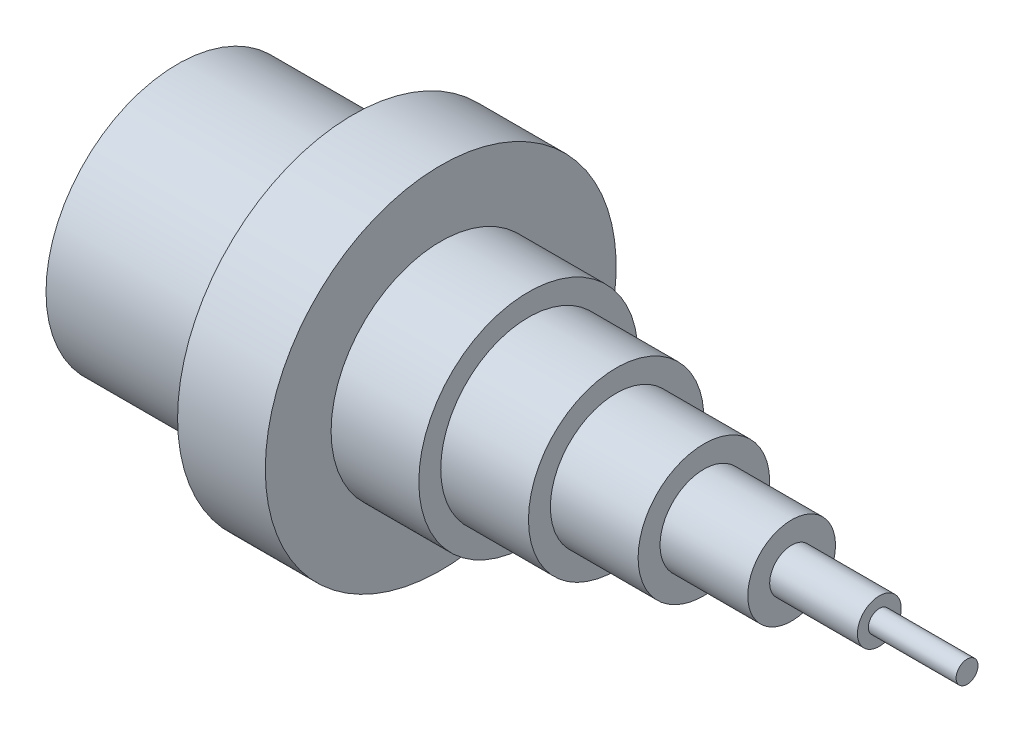
ISO-10303-21;
HEADER;
FILE_DESCRIPTION(('STEP AP214'),'2;1');
FILE_NAME('part.step','',(''),(''),'','','');
FILE_SCHEMA(('AUTOMOTIVE_DESIGN { 1 0 10303 214 1 1 1 1 }'));
ENDSEC;
DATA;
#1=APPLICATION_CONTEXT('core data for automotive mechanical design processes');
#2=APPLICATION_PROTOCOL_DEFINITION('international standard','automotive_design',2000,#1);
#3=PRODUCT_CONTEXT('',#1,'mechanical');
#4=PRODUCT('Part','Part','',(#3));
#5=PRODUCT_RELATED_PRODUCT_CATEGORY('part','',(#4));
#6=PRODUCT_DEFINITION_FORMATION('','',#4);
#7=PRODUCT_DEFINITION_CONTEXT('part definition',#1,'design');
#8=PRODUCT_DEFINITION('design','',#6,#7);
#9=PRODUCT_DEFINITION_SHAPE('','',#8);
#10=(LENGTH_UNIT() NAMED_UNIT(*) SI_UNIT(.MILLI.,.METRE.));
#11=(NAMED_UNIT(*) PLANE_ANGLE_UNIT() SI_UNIT($,.RADIAN.));
#12=(NAMED_UNIT(*) SI_UNIT($,.STERADIAN.) SOLID_ANGLE_UNIT());
#13=UNCERTAINTY_MEASURE_WITH_UNIT(LENGTH_MEASURE(1.E-05),#10,'distance_accuracy_value','');
#14=(GEOMETRIC_REPRESENTATION_CONTEXT(3) GLOBAL_UNCERTAINTY_ASSIGNED_CONTEXT((#13)) GLOBAL_UNIT_ASSIGNED_CONTEXT((#10,
#11,#12)) REPRESENTATION_CONTEXT('',''));
#15=CARTESIAN_POINT('',(0.,0.,0.));
#16=DIRECTION('',(0.,0.,1.));
#17=DIRECTION('',(1.,0.,0.));
#18=AXIS2_PLACEMENT_3D('',#15,#16,#17);
#19=CARTESIAN_POINT('',(0.,0.,0.));
#20=DIRECTION('',(-1.,0.,0.));
#21=DIRECTION('',(0.,0.,1.));
#22=AXIS2_PLACEMENT_3D('',#19,#20,#21);
#23=CYLINDRICAL_SURFACE('',#22,30.);
#24=CARTESIAN_POINT('',(-40.,0.,0.));
#25=DIRECTION('',(-1.,0.,0.));
#26=DIRECTION('',(0.,0.,1.));
#27=AXIS2_PLACEMENT_3D('',#24,#25,#26);
#28=CIRCLE('',#27,30.);
#29=CARTESIAN_POINT('',(-40.,0.,30.));
#30=VERTEX_POINT('',#29);
#31=EDGE_CURVE('E10',#30,#30,#28,.T.);
#32=ORIENTED_EDGE('',*,*,#31,.F.);
#33=EDGE_LOOP('',(#32));
#34=FACE_BOUND('',#33,.T.);
#35=CARTESIAN_POINT('',(0.,0.,0.));
#36=DIRECTION('',(-1.,0.,0.));
#37=DIRECTION('',(0.,0.,1.));
#38=AXIS2_PLACEMENT_3D('',#35,#36,#37);
#39=CIRCLE('',#38,30.);
#40=CARTESIAN_POINT('',(0.,0.,30.));
#41=VERTEX_POINT('',#40);
#42=EDGE_CURVE('E91',#41,#41,#39,.T.);
#43=ORIENTED_EDGE('',*,*,#42,.T.);
#44=EDGE_LOOP('',(#43));
#45=FACE_BOUND('',#44,.T.);
#46=ADVANCED_FACE('F33',(#34,#45),#23,.T.);
#47=CARTESIAN_POINT('',(-40.,0.,0.));
#48=DIRECTION('',(1.,0.,0.));
#49=DIRECTION('',(0.,0.,-1.));
#50=AXIS2_PLACEMENT_3D('',#47,#48,#49);
#51=PLANE('',#50);
#52=CARTESIAN_POINT('',(-40.,0.,0.));
#53=DIRECTION('',(-1.,0.,0.));
#54=DIRECTION('',(0.,0.,1.));
#55=AXIS2_PLACEMENT_3D('',#52,#53,#54);
#56=CIRCLE('',#55,20.);
#57=CARTESIAN_POINT('',(-40.,0.,20.));
#58=VERTEX_POINT('',#57);
#59=EDGE_CURVE('E39',#58,#58,#56,.T.);
#60=ORIENTED_EDGE('',*,*,#59,.F.);
#61=EDGE_LOOP('',(#60));
#62=FACE_BOUND('',#61,.T.);
#63=ORIENTED_EDGE('',*,*,#31,.T.);
#64=EDGE_LOOP('',(#63));
#65=FACE_BOUND('',#64,.T.);
#66=ADVANCED_FACE('F113',(#62,#65),#51,.F.);
#67=CARTESIAN_POINT('',(0.,0.,0.));
#68=DIRECTION('',(-1.,0.,0.));
#69=DIRECTION('',(0.,0.,1.));
#70=AXIS2_PLACEMENT_3D('',#67,#68,#69);
#71=CYLINDRICAL_SURFACE('',#70,20.);
#72=ORIENTED_EDGE('',*,*,#59,.T.);
#73=EDGE_LOOP('',(#72));
#74=FACE_BOUND('',#73,.T.);
#75=CARTESIAN_POINT('',(0.,0.,0.));
#76=DIRECTION('',(-1.,0.,0.));
#77=DIRECTION('',(0.,0.,1.));
#78=AXIS2_PLACEMENT_3D('',#75,#76,#77);
#79=CIRCLE('',#78,20.);
#80=CARTESIAN_POINT('',(0.,0.,20.));
#81=VERTEX_POINT('',#80);
#82=EDGE_CURVE('E43',#81,#81,#79,.T.);
#83=ORIENTED_EDGE('',*,*,#82,.F.);
#84=EDGE_LOOP('',(#83));
#85=FACE_BOUND('',#84,.T.);
#86=ADVANCED_FACE('F110',(#74,#85),#71,.F.);
#87=CARTESIAN_POINT('',(0.,0.,0.));
#88=DIRECTION('',(-1.,0.,0.));
#89=DIRECTION('',(0.,0.,1.));
#90=AXIS2_PLACEMENT_3D('',#87,#88,#89);
#91=PLANE('',#90);
#92=ORIENTED_EDGE('',*,*,#82,.T.);
#93=EDGE_LOOP('',(#92));
#94=FACE_BOUND('',#93,.T.);
#95=ADVANCED_FACE('F101',(#94),#91,.T.);
#96=CARTESIAN_POINT('',(140.,0.,0.));
#97=DIRECTION('',(-1.,0.,0.));
#98=DIRECTION('',(0.,0.,1.));
#99=AXIS2_PLACEMENT_3D('',#96,#97,#98);
#100=PLANE('',#99);
#101=CARTESIAN_POINT('',(140.,0.,0.));
#102=DIRECTION('',(-1.,0.,0.));
#103=DIRECTION('',(0.,0.,1.));
#104=AXIS2_PLACEMENT_3D('',#101,#102,#103);
#105=CIRCLE('',#104,2.5);
#106=CARTESIAN_POINT('',(140.,0.,2.5));
#107=VERTEX_POINT('',#106);
#108=EDGE_CURVE('E47',#107,#107,#105,.T.);
#109=ORIENTED_EDGE('',*,*,#108,.F.);
#110=EDGE_LOOP('',(#109));
#111=FACE_BOUND('',#110,.T.);
#112=ADVANCED_FACE('F109',(#111),#100,.F.);
#113=CARTESIAN_POINT('',(0.,0.,0.));
#114=DIRECTION('',(-1.,0.,0.));
#115=DIRECTION('',(0.,0.,1.));
#116=AXIS2_PLACEMENT_3D('',#113,#114,#115);
#117=CYLINDRICAL_SURFACE('',#116,2.5);
#118=ORIENTED_EDGE('',*,*,#108,.T.);
#119=EDGE_LOOP('',(#118));
#120=FACE_BOUND('',#119,.T.);
#121=CARTESIAN_POINT('',(120.,0.,0.));
#122=DIRECTION('',(-1.,0.,0.));
#123=DIRECTION('',(0.,0.,1.));
#124=AXIS2_PLACEMENT_3D('',#121,#122,#123);
#125=CIRCLE('',#124,2.5);
#126=CARTESIAN_POINT('',(120.,0.,2.5));
#127=VERTEX_POINT('',#126);
#128=EDGE_CURVE('E52',#127,#127,#125,.T.);
#129=ORIENTED_EDGE('',*,*,#128,.F.);
#130=EDGE_LOOP('',(#129));
#131=FACE_BOUND('',#130,.T.);
#132=ADVANCED_FACE('F126',(#120,#131),#117,.T.);
#133=CARTESIAN_POINT('',(120.,0.,0.));
#134=DIRECTION('',(-1.,0.,0.));
#135=DIRECTION('',(0.,0.,1.));
#136=AXIS2_PLACEMENT_3D('',#133,#134,#135);
#137=PLANE('',#136);
#138=CARTESIAN_POINT('',(120.,0.,0.));
#139=DIRECTION('',(-1.,0.,0.));
#140=DIRECTION('',(0.,0.,1.));
#141=AXIS2_PLACEMENT_3D('',#138,#139,#140);
#142=CIRCLE('',#141,5.);
#143=CARTESIAN_POINT('',(120.,0.,5.));
#144=VERTEX_POINT('',#143);
#145=EDGE_CURVE('E55',#144,#144,#142,.T.);
#146=ORIENTED_EDGE('',*,*,#145,.F.);
#147=EDGE_LOOP('',(#146));
#148=FACE_BOUND('',#147,.T.);
#149=ORIENTED_EDGE('',*,*,#128,.T.);
#150=EDGE_LOOP('',(#149));
#151=FACE_BOUND('',#150,.T.);
#152=ADVANCED_FACE('F130',(#148,#151),#137,.F.);
#153=CARTESIAN_POINT('',(0.,0.,0.));
#154=DIRECTION('',(-1.,0.,0.));
#155=DIRECTION('',(0.,0.,1.));
#156=AXIS2_PLACEMENT_3D('',#153,#154,#155);
#157=CYLINDRICAL_SURFACE('',#156,5.);
#158=ORIENTED_EDGE('',*,*,#145,.T.);
#159=EDGE_LOOP('',(#158));
#160=FACE_BOUND('',#159,.T.);
#161=CARTESIAN_POINT('',(100.,0.,0.));
#162=DIRECTION('',(-1.,0.,0.));
#163=DIRECTION('',(0.,0.,1.));
#164=AXIS2_PLACEMENT_3D('',#161,#162,#163);
#165=CIRCLE('',#164,5.);
#166=CARTESIAN_POINT('',(100.,0.,5.));
#167=VERTEX_POINT('',#166);
#168=EDGE_CURVE('E58',#167,#167,#165,.T.);
#169=ORIENTED_EDGE('',*,*,#168,.F.);
#170=EDGE_LOOP('',(#169));
#171=FACE_BOUND('',#170,.T.);
#172=ADVANCED_FACE('F134',(#160,#171),#157,.T.);
#173=CARTESIAN_POINT('',(100.,0.,0.));
#174=DIRECTION('',(-1.,0.,0.));
#175=DIRECTION('',(0.,0.,1.));
#176=AXIS2_PLACEMENT_3D('',#173,#174,#175);
#177=PLANE('',#176);
#178=CARTESIAN_POINT('',(100.,0.,0.));
#179=DIRECTION('',(-1.,0.,0.));
#180=DIRECTION('',(0.,0.,1.));
#181=AXIS2_PLACEMENT_3D('',#178,#179,#180);
#182=CIRCLE('',#181,10.);
#183=CARTESIAN_POINT('',(100.,0.,10.));
#184=VERTEX_POINT('',#183);
#185=EDGE_CURVE('E61',#184,#184,#182,.T.);
#186=ORIENTED_EDGE('',*,*,#185,.F.);
#187=EDGE_LOOP('',(#186));
#188=FACE_BOUND('',#187,.T.);
#189=ORIENTED_EDGE('',*,*,#168,.T.);
#190=EDGE_LOOP('',(#189));
#191=FACE_BOUND('',#190,.T.);
#192=ADVANCED_FACE('F138',(#188,#191),#177,.F.);
#193=CARTESIAN_POINT('',(0.,0.,0.));
#194=DIRECTION('',(-1.,0.,0.));
#195=DIRECTION('',(0.,0.,1.));
#196=AXIS2_PLACEMENT_3D('',#193,#194,#195);
#197=CYLINDRICAL_SURFACE('',#196,10.);
#198=ORIENTED_EDGE('',*,*,#185,.T.);
#199=EDGE_LOOP('',(#198));
#200=FACE_BOUND('',#199,.T.);
#201=CARTESIAN_POINT('',(80.,0.,0.));
#202=DIRECTION('',(-1.,0.,0.));
#203=DIRECTION('',(0.,0.,1.));
#204=AXIS2_PLACEMENT_3D('',#201,#202,#203);
#205=CIRCLE('',#204,10.);
#206=CARTESIAN_POINT('',(80.,0.,10.));
#207=VERTEX_POINT('',#206);
#208=EDGE_CURVE('E64',#207,#207,#205,.T.);
#209=ORIENTED_EDGE('',*,*,#208,.F.);
#210=EDGE_LOOP('',(#209));
#211=FACE_BOUND('',#210,.T.);
#212=ADVANCED_FACE('F142',(#200,#211),#197,.T.);
#213=CARTESIAN_POINT('',(80.,0.,0.));
#214=DIRECTION('',(-1.,0.,0.));
#215=DIRECTION('',(0.,0.,1.));
#216=AXIS2_PLACEMENT_3D('',#213,#214,#215);
#217=PLANE('',#216);
#218=CARTESIAN_POINT('',(80.,0.,0.));
#219=DIRECTION('',(-1.,0.,0.));
#220=DIRECTION('',(0.,0.,1.));
#221=AXIS2_PLACEMENT_3D('',#218,#219,#220);
#222=CIRCLE('',#221,15.);
#223=CARTESIAN_POINT('',(80.,0.,15.));
#224=VERTEX_POINT('',#223);
#225=EDGE_CURVE('E67',#224,#224,#222,.T.);
#226=ORIENTED_EDGE('',*,*,#225,.F.);
#227=EDGE_LOOP('',(#226));
#228=FACE_BOUND('',#227,.T.);
#229=ORIENTED_EDGE('',*,*,#208,.T.);
#230=EDGE_LOOP('',(#229));
#231=FACE_BOUND('',#230,.T.);
#232=ADVANCED_FACE('F146',(#228,#231),#217,.F.);
#233=CARTESIAN_POINT('',(0.,0.,0.));
#234=DIRECTION('',(-1.,0.,0.));
#235=DIRECTION('',(0.,0.,1.));
#236=AXIS2_PLACEMENT_3D('',#233,#234,#235);
#237=CYLINDRICAL_SURFACE('',#236,15.);
#238=ORIENTED_EDGE('',*,*,#225,.T.);
#239=EDGE_LOOP('',(#238));
#240=FACE_BOUND('',#239,.T.);
#241=CARTESIAN_POINT('',(60.,0.,0.));
#242=DIRECTION('',(-1.,0.,0.));
#243=DIRECTION('',(0.,0.,1.));
#244=AXIS2_PLACEMENT_3D('',#241,#242,#243);
#245=CIRCLE('',#244,15.);
#246=CARTESIAN_POINT('',(60.,0.,15.));
#247=VERTEX_POINT('',#246);
#248=EDGE_CURVE('E70',#247,#247,#245,.T.);
#249=ORIENTED_EDGE('',*,*,#248,.F.);
#250=EDGE_LOOP('',(#249));
#251=FACE_BOUND('',#250,.T.);
#252=ADVANCED_FACE('F150',(#240,#251),#237,.T.);
#253=CARTESIAN_POINT('',(60.,0.,0.));
#254=DIRECTION('',(-1.,0.,0.));
#255=DIRECTION('',(0.,0.,1.));
#256=AXIS2_PLACEMENT_3D('',#253,#254,#255);
#257=PLANE('',#256);
#258=CARTESIAN_POINT('',(60.,0.,0.));
#259=DIRECTION('',(-1.,0.,0.));
#260=DIRECTION('',(0.,0.,1.));
#261=AXIS2_PLACEMENT_3D('',#258,#259,#260);
#262=CIRCLE('',#261,20.);
#263=CARTESIAN_POINT('',(60.,0.,20.));
#264=VERTEX_POINT('',#263);
#265=EDGE_CURVE('E73',#264,#264,#262,.T.);
#266=ORIENTED_EDGE('',*,*,#265,.F.);
#267=EDGE_LOOP('',(#266));
#268=FACE_BOUND('',#267,.T.);
#269=ORIENTED_EDGE('',*,*,#248,.T.);
#270=EDGE_LOOP('',(#269));
#271=FACE_BOUND('',#270,.T.);
#272=ADVANCED_FACE('F154',(#268,#271),#257,.F.);
#273=CARTESIAN_POINT('',(0.,0.,0.));
#274=DIRECTION('',(-1.,0.,0.));
#275=DIRECTION('',(0.,0.,1.));
#276=AXIS2_PLACEMENT_3D('',#273,#274,#275);
#277=CYLINDRICAL_SURFACE('',#276,20.);
#278=ORIENTED_EDGE('',*,*,#265,.T.);
#279=EDGE_LOOP('',(#278));
#280=FACE_BOUND('',#279,.T.);
#281=CARTESIAN_POINT('',(40.,0.,0.));
#282=DIRECTION('',(-1.,0.,0.));
#283=DIRECTION('',(0.,0.,1.));
#284=AXIS2_PLACEMENT_3D('',#281,#282,#283);
#285=CIRCLE('',#284,20.);
#286=CARTESIAN_POINT('',(40.,0.,20.));
#287=VERTEX_POINT('',#286);
#288=EDGE_CURVE('E76',#287,#287,#285,.T.);
#289=ORIENTED_EDGE('',*,*,#288,.F.);
#290=EDGE_LOOP('',(#289));
#291=FACE_BOUND('',#290,.T.);
#292=ADVANCED_FACE('F158',(#280,#291),#277,.T.);
#293=CARTESIAN_POINT('',(40.,0.,0.));
#294=DIRECTION('',(-1.,0.,0.));
#295=DIRECTION('',(0.,0.,1.));
#296=AXIS2_PLACEMENT_3D('',#293,#294,#295);
#297=PLANE('',#296);
#298=CARTESIAN_POINT('',(40.,0.,0.));
#299=DIRECTION('',(-1.,0.,0.));
#300=DIRECTION('',(0.,0.,1.));
#301=AXIS2_PLACEMENT_3D('',#298,#299,#300);
#302=CIRCLE('',#301,25.);
#303=CARTESIAN_POINT('',(40.,0.,25.));
#304=VERTEX_POINT('',#303);
#305=EDGE_CURVE('E79',#304,#304,#302,.T.);
#306=ORIENTED_EDGE('',*,*,#305,.F.);
#307=EDGE_LOOP('',(#306));
#308=FACE_BOUND('',#307,.T.);
#309=ORIENTED_EDGE('',*,*,#288,.T.);
#310=EDGE_LOOP('',(#309));
#311=FACE_BOUND('',#310,.T.);
#312=ADVANCED_FACE('F162',(#308,#311),#297,.F.);
#313=CARTESIAN_POINT('',(0.,0.,0.));
#314=DIRECTION('',(-1.,0.,0.));
#315=DIRECTION('',(0.,0.,1.));
#316=AXIS2_PLACEMENT_3D('',#313,#314,#315);
#317=CYLINDRICAL_SURFACE('',#316,25.);
#318=ORIENTED_EDGE('',*,*,#305,.T.);
#319=EDGE_LOOP('',(#318));
#320=FACE_BOUND('',#319,.T.);
#321=CARTESIAN_POINT('',(20.,0.,0.));
#322=DIRECTION('',(-1.,0.,0.));
#323=DIRECTION('',(0.,0.,1.));
#324=AXIS2_PLACEMENT_3D('',#321,#322,#323);
#325=CIRCLE('',#324,25.);
#326=CARTESIAN_POINT('',(20.,0.,25.));
#327=VERTEX_POINT('',#326);
#328=EDGE_CURVE('E82',#327,#327,#325,.T.);
#329=ORIENTED_EDGE('',*,*,#328,.F.);
#330=EDGE_LOOP('',(#329));
#331=FACE_BOUND('',#330,.T.);
#332=ADVANCED_FACE('F166',(#320,#331),#317,.T.);
#333=CARTESIAN_POINT('',(20.,0.,0.));
#334=DIRECTION('',(-1.,0.,0.));
#335=DIRECTION('',(0.,0.,1.));
#336=AXIS2_PLACEMENT_3D('',#333,#334,#335);
#337=PLANE('',#336);
#338=CARTESIAN_POINT('',(20.,0.,0.));
#339=DIRECTION('',(-1.,0.,0.));
#340=DIRECTION('',(0.,0.,1.));
#341=AXIS2_PLACEMENT_3D('',#338,#339,#340);
#342=CIRCLE('',#341,40.);
#343=CARTESIAN_POINT('',(20.,0.,40.));
#344=VERTEX_POINT('',#343);
#345=EDGE_CURVE('E85',#344,#344,#342,.T.);
#346=ORIENTED_EDGE('',*,*,#345,.F.);
#347=EDGE_LOOP('',(#346));
#348=FACE_BOUND('',#347,.T.);
#349=ORIENTED_EDGE('',*,*,#328,.T.);
#350=EDGE_LOOP('',(#349));
#351=FACE_BOUND('',#350,.T.);
#352=ADVANCED_FACE('F105',(#348,#351),#337,.F.);
#353=CARTESIAN_POINT('',(0.,0.,0.));
#354=DIRECTION('',(-1.,0.,0.));
#355=DIRECTION('',(0.,0.,1.));
#356=AXIS2_PLACEMENT_3D('',#353,#354,#355);
#357=CYLINDRICAL_SURFACE('',#356,40.);
#358=ORIENTED_EDGE('',*,*,#345,.T.);
#359=EDGE_LOOP('',(#358));
#360=FACE_BOUND('',#359,.T.);
#361=CARTESIAN_POINT('',(0.,0.,0.));
#362=DIRECTION('',(-1.,0.,0.));
#363=DIRECTION('',(0.,0.,1.));
#364=AXIS2_PLACEMENT_3D('',#361,#362,#363);
#365=CIRCLE('',#364,40.);
#366=CARTESIAN_POINT('',(0.,0.,40.));
#367=VERTEX_POINT('',#366);
#368=EDGE_CURVE('E88',#367,#367,#365,.T.);
#369=ORIENTED_EDGE('',*,*,#368,.F.);
#370=EDGE_LOOP('',(#369));
#371=FACE_BOUND('',#370,.T.);
#372=ADVANCED_FACE('F98',(#360,#371),#357,.T.);
#373=ORIENTED_EDGE('',*,*,#368,.T.);
#374=EDGE_LOOP('',(#373));
#375=FACE_BOUND('',#374,.T.);
#376=ORIENTED_EDGE('',*,*,#42,.F.);
#377=EDGE_LOOP('',(#376));
#378=FACE_BOUND('',#377,.T.);
#379=ADVANCED_FACE('F96',(#375,#378),#91,.T.);
#380=CLOSED_SHELL('',(#46,#66,#86,#95,#112,#132,#152,#172,#192,#212,#232,#252,#272,#292,#312,
#332,#352,#372,#379));
#381=MANIFOLD_SOLID_BREP('B2',#380);
#382=ADVANCED_BREP_SHAPE_REPRESENTATION('',(#18,#381),#14);
#383=SHAPE_DEFINITION_REPRESENTATION(#9,#382);
ENDSEC;
END-ISO-10303-21;
